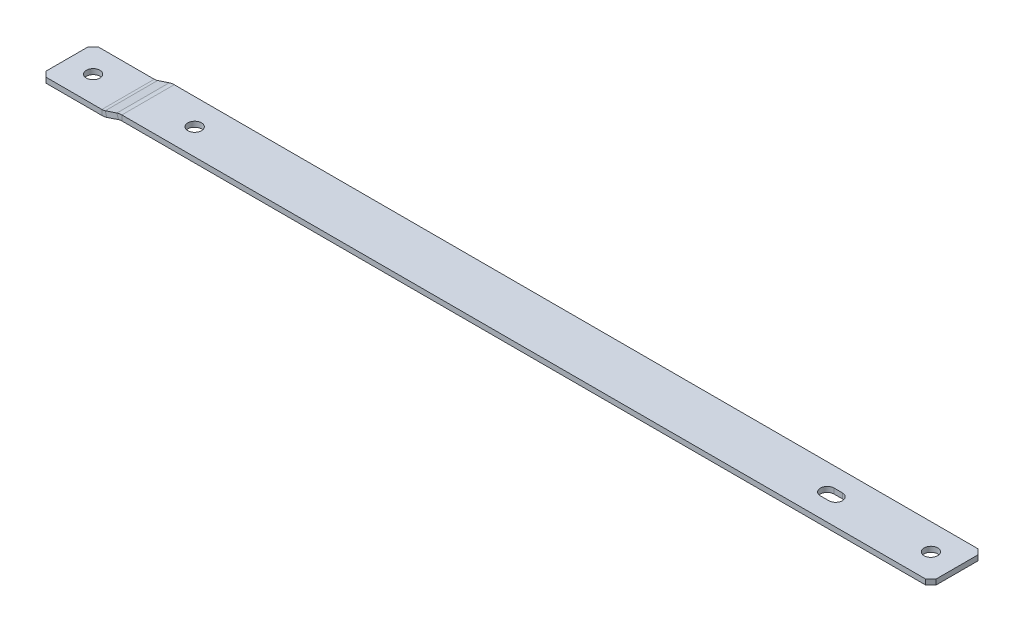
ISO-10303-21;
HEADER;
FILE_DESCRIPTION(('STEP AP214'),'2;1');
FILE_NAME('part.step','',(''),(''),'','','');
FILE_SCHEMA(('AUTOMOTIVE_DESIGN { 1 0 10303 214 1 1 1 1 }'));
ENDSEC;
DATA;
#1=APPLICATION_CONTEXT('core data for automotive mechanical design processes');
#2=APPLICATION_PROTOCOL_DEFINITION('international standard','automotive_design',2000,#1);
#3=PRODUCT_CONTEXT('',#1,'mechanical');
#4=PRODUCT('Part','Part','',(#3));
#5=PRODUCT_RELATED_PRODUCT_CATEGORY('part','',(#4));
#6=PRODUCT_DEFINITION_FORMATION('','',#4);
#7=PRODUCT_DEFINITION_CONTEXT('part definition',#1,'design');
#8=PRODUCT_DEFINITION('design','',#6,#7);
#9=PRODUCT_DEFINITION_SHAPE('','',#8);
#10=(LENGTH_UNIT() NAMED_UNIT(*) SI_UNIT(.MILLI.,.METRE.));
#11=(NAMED_UNIT(*) PLANE_ANGLE_UNIT() SI_UNIT($,.RADIAN.));
#12=(NAMED_UNIT(*) SI_UNIT($,.STERADIAN.) SOLID_ANGLE_UNIT());
#13=UNCERTAINTY_MEASURE_WITH_UNIT(LENGTH_MEASURE(1.E-05),#10,'distance_accuracy_value','');
#14=(GEOMETRIC_REPRESENTATION_CONTEXT(3) GLOBAL_UNCERTAINTY_ASSIGNED_CONTEXT((#13)) GLOBAL_UNIT_ASSIGNED_CONTEXT((#10,
#11,#12)) REPRESENTATION_CONTEXT('',''));
#15=CARTESIAN_POINT('',(0.,0.,0.));
#16=DIRECTION('',(0.,0.,1.));
#17=DIRECTION('',(1.,0.,0.));
#18=AXIS2_PLACEMENT_3D('',#15,#16,#17);
#19=CARTESIAN_POINT('',(-282.91568932488,0.,50.));
#20=DIRECTION('',(0.,0.,1.));
#21=DIRECTION('',(1.,0.,0.));
#22=AXIS2_PLACEMENT_3D('',#19,#20,#21);
#23=PLANE('',#22);
#24=DIRECTION('',(0.,-1.,0.));
#25=VECTOR('',#24,1.);
#26=CARTESIAN_POINT('',(-282.91568932488,0.,50.));
#27=LINE('',#26,#25);
#28=CARTESIAN_POINT('',(-282.91568932488,0.,50.));
#29=VERTEX_POINT('',#28);
#30=CARTESIAN_POINT('',(-282.91568932488,-5.,50.));
#31=VERTEX_POINT('',#30);
#32=EDGE_CURVE('E332',#29,#31,#27,.T.);
#33=ORIENTED_EDGE('',*,*,#32,.F.);
#34=CARTESIAN_POINT('',(-282.91568932488,-15.,50.));
#35=DIRECTION('',(0.,0.,-1.));
#36=DIRECTION('',(-1.,0.,0.));
#37=AXIS2_PLACEMENT_3D('',#34,#35,#36);
#38=CIRCLE('',#37,15.);
#39=CARTESIAN_POINT('',(-287.659105815132,-0.769750529242294,50.));
#40=VERTEX_POINT('',#39);
#41=EDGE_CURVE('E236',#40,#29,#38,.T.);
#42=ORIENTED_EDGE('',*,*,#41,.F.);
#43=DIRECTION('',(-0.316227766016841,0.948683298050513,0.));
#44=VECTOR('',#43,1.);
#45=CARTESIAN_POINT('',(-286.077966985048,-5.51316701949486,50.));
#46=LINE('',#45,#44);
#47=CARTESIAN_POINT('',(-286.077966985048,-5.51316701949486,50.));
#48=VERTEX_POINT('',#47);
#49=EDGE_CURVE('E330',#48,#40,#46,.T.);
#50=ORIENTED_EDGE('',*,*,#49,.F.);
#51=CARTESIAN_POINT('',(-282.91568932488,-15.,50.));
#52=DIRECTION('',(0.,0.,1.));
#53=DIRECTION('',(1.,0.,0.));
#54=AXIS2_PLACEMENT_3D('',#51,#52,#53);
#55=CIRCLE('',#54,10.);
#56=EDGE_CURVE('E255',#48,#31,#55,.F.);
#57=ORIENTED_EDGE('',*,*,#56,.T.);
#58=EDGE_LOOP('',(#33,#42,#50,#57));
#59=FACE_BOUND('',#58,.T.);
#60=ADVANCED_FACE('F43',(#59),#23,.T.);
#61=CARTESIAN_POINT('',(-286.077966985048,-5.51316701949486,50.));
#62=DIRECTION('',(0.,0.,1.));
#63=DIRECTION('',(1.,0.,0.));
#64=AXIS2_PLACEMENT_3D('',#61,#62,#63);
#65=PLANE('',#64);
#66=DIRECTION('',(1.,0.,0.));
#67=VECTOR('',#66,1.);
#68=CARTESIAN_POINT('',(-285.349854227405,-5.,50.));
#69=LINE('',#68,#67);
#70=CARTESIAN_POINT('',(484.650145772595,-5.,50.));
#71=VERTEX_POINT('',#70);
#72=EDGE_CURVE('E229',#31,#71,#69,.T.);
#73=ORIENTED_EDGE('',*,*,#72,.T.);
#74=DIRECTION('',(0.,1.,0.));
#75=VECTOR('',#74,1.);
#76=CARTESIAN_POINT('',(484.650145772594,-5.51316701950342,50.));
#77=LINE('',#76,#75);
#78=CARTESIAN_POINT('',(484.650145772595,0.,50.));
#79=VERTEX_POINT('',#78);
#80=EDGE_CURVE('E355',#71,#79,#77,.T.);
#81=ORIENTED_EDGE('',*,*,#80,.T.);
#82=DIRECTION('',(1.,0.,0.));
#83=VECTOR('',#82,1.);
#84=CARTESIAN_POINT('',(-285.349854227405,0.,50.));
#85=LINE('',#84,#83);
#86=EDGE_CURVE('E232',#29,#79,#85,.T.);
#87=ORIENTED_EDGE('',*,*,#86,.F.);
#88=ORIENTED_EDGE('',*,*,#32,.T.);
#89=EDGE_LOOP('',(#73,#81,#87,#88));
#90=FACE_BOUND('',#89,.T.);
#91=ADVANCED_FACE('F445',(#90),#65,.T.);
#92=CARTESIAN_POINT('',(-287.659105815132,-0.769750529242294,0.));
#93=DIRECTION('',(0.,0.,-1.));
#94=DIRECTION('',(-1.,0.,0.));
#95=AXIS2_PLACEMENT_3D('',#92,#93,#94);
#96=PLANE('',#95);
#97=DIRECTION('',(0.316227766016841,-0.948683298050513,0.));
#98=VECTOR('',#97,1.);
#99=CARTESIAN_POINT('',(-287.659105815132,-0.769750529242294,0.));
#100=LINE('',#99,#98);
#101=CARTESIAN_POINT('',(-287.659105815132,-0.769750529242294,0.));
#102=VERTEX_POINT('',#101);
#103=CARTESIAN_POINT('',(-286.077966985048,-5.51316701949486,0.));
#104=VERTEX_POINT('',#103);
#105=EDGE_CURVE('E328',#102,#104,#100,.T.);
#106=ORIENTED_EDGE('',*,*,#105,.F.);
#107=CARTESIAN_POINT('',(-282.91568932488,-15.,0.));
#108=DIRECTION('',(0.,0.,-1.));
#109=DIRECTION('',(-1.,0.,0.));
#110=AXIS2_PLACEMENT_3D('',#107,#108,#109);
#111=CIRCLE('',#110,15.);
#112=CARTESIAN_POINT('',(-282.91568932488,0.,0.));
#113=VERTEX_POINT('',#112);
#114=EDGE_CURVE('E264',#102,#113,#111,.T.);
#115=ORIENTED_EDGE('',*,*,#114,.T.);
#116=DIRECTION('',(0.,1.,0.));
#117=VECTOR('',#116,1.);
#118=CARTESIAN_POINT('',(-282.91568932488,-5.,0.));
#119=LINE('',#118,#117);
#120=CARTESIAN_POINT('',(-282.91568932488,-5.,0.));
#121=VERTEX_POINT('',#120);
#122=EDGE_CURVE('E326',#121,#113,#119,.T.);
#123=ORIENTED_EDGE('',*,*,#122,.F.);
#124=CARTESIAN_POINT('',(-282.91568932488,-15.,0.));
#125=DIRECTION('',(0.,0.,1.));
#126=DIRECTION('',(1.,0.,0.));
#127=AXIS2_PLACEMENT_3D('',#124,#125,#126);
#128=CIRCLE('',#127,10.);
#129=EDGE_CURVE('E233',#104,#121,#128,.F.);
#130=ORIENTED_EDGE('',*,*,#129,.F.);
#131=EDGE_LOOP('',(#106,#115,#123,#130));
#132=FACE_BOUND('',#131,.T.);
#133=ADVANCED_FACE('F421',(#132),#96,.T.);
#134=CARTESIAN_POINT('',(-282.91568932488,-5.,0.));
#135=DIRECTION('',(0.,0.,-1.));
#136=DIRECTION('',(-1.,0.,0.));
#137=AXIS2_PLACEMENT_3D('',#134,#135,#136);
#138=PLANE('',#137);
#139=DIRECTION('',(0.948683298050514,0.316227766016838,0.));
#140=VECTOR('',#139,1.);
#141=CARTESIAN_POINT('',(-285.349854227405,0.,0.));
#142=LINE('',#141,#140);
#143=CARTESIAN_POINT('',(-298.810353168921,-4.48683298050514,0.));
#144=VERTEX_POINT('',#143);
#145=EDGE_CURVE('E267',#144,#102,#142,.T.);
#146=ORIENTED_EDGE('',*,*,#145,.T.);
#147=ORIENTED_EDGE('',*,*,#105,.T.);
#148=DIRECTION('',(0.948683298050514,0.316227766016838,0.));
#149=VECTOR('',#148,1.);
#150=CARTESIAN_POINT('',(-283.768715397321,-4.74341649025257,0.));
#151=LINE('',#150,#149);
#152=CARTESIAN_POINT('',(-297.229214338836,-9.23024947075771,0.));
#153=VERTEX_POINT('',#152);
#154=EDGE_CURVE('E280',#153,#104,#151,.T.);
#155=ORIENTED_EDGE('',*,*,#154,.F.);
#156=DIRECTION('',(-0.316227766016841,0.948683298050513,0.));
#157=VECTOR('',#156,1.);
#158=CARTESIAN_POINT('',(-297.229214338836,-9.23024947075771,0.));
#159=LINE('',#158,#157);
#160=EDGE_CURVE('E316',#153,#144,#159,.T.);
#161=ORIENTED_EDGE('',*,*,#160,.T.);
#162=EDGE_LOOP('',(#146,#147,#155,#161));
#163=FACE_BOUND('',#162,.T.);
#164=ADVANCED_FACE('F403',(#163),#138,.T.);
#165=CARTESIAN_POINT('',(-298.810353168921,-4.48683298050514,50.));
#166=DIRECTION('',(0.,0.,1.));
#167=DIRECTION('',(1.,0.,0.));
#168=AXIS2_PLACEMENT_3D('',#165,#166,#167);
#169=PLANE('',#168);
#170=DIRECTION('',(0.316227766016841,-0.948683298050513,0.));
#171=VECTOR('',#170,1.);
#172=CARTESIAN_POINT('',(-298.810353168921,-4.48683298050514,50.));
#173=LINE('',#172,#171);
#174=CARTESIAN_POINT('',(-298.810353168921,-4.48683298050514,50.));
#175=VERTEX_POINT('',#174);
#176=CARTESIAN_POINT('',(-297.229214338836,-9.23024947075771,50.));
#177=VERTEX_POINT('',#176);
#178=EDGE_CURVE('E324',#175,#177,#173,.T.);
#179=ORIENTED_EDGE('',*,*,#178,.F.);
#180=CARTESIAN_POINT('',(-301.972630829089,5.,50.));
#181=DIRECTION('',(0.,0.,1.));
#182=DIRECTION('',(1.,0.,0.));
#183=AXIS2_PLACEMENT_3D('',#180,#181,#182);
#184=CIRCLE('',#183,10.);
#185=CARTESIAN_POINT('',(-301.972630829089,-5.00000000000001,50.));
#186=VERTEX_POINT('',#185);
#187=EDGE_CURVE('E242',#186,#175,#184,.T.);
#188=ORIENTED_EDGE('',*,*,#187,.F.);
#189=DIRECTION('',(0.,1.,0.));
#190=VECTOR('',#189,1.);
#191=CARTESIAN_POINT('',(-301.972630829089,-10.,50.));
#192=LINE('',#191,#190);
#193=CARTESIAN_POINT('',(-301.972630829089,-10.,50.));
#194=VERTEX_POINT('',#193);
#195=EDGE_CURVE('E321',#194,#186,#192,.T.);
#196=ORIENTED_EDGE('',*,*,#195,.F.);
#197=CARTESIAN_POINT('',(-301.972630829089,5.,50.));
#198=DIRECTION('',(0.,0.,1.));
#199=DIRECTION('',(1.,0.,0.));
#200=AXIS2_PLACEMENT_3D('',#197,#198,#199);
#201=CIRCLE('',#200,15.);
#202=EDGE_CURVE('E249',#194,#177,#201,.T.);
#203=ORIENTED_EDGE('',*,*,#202,.T.);
#204=EDGE_LOOP('',(#179,#188,#196,#203));
#205=FACE_BOUND('',#204,.T.);
#206=ADVANCED_FACE('F437',(#205),#169,.T.);
#207=CARTESIAN_POINT('',(-301.972630829089,-10.,50.));
#208=DIRECTION('',(0.,0.,1.));
#209=DIRECTION('',(1.,0.,0.));
#210=AXIS2_PLACEMENT_3D('',#207,#208,#209);
#211=PLANE('',#210);
#212=DIRECTION('',(0.948683298050514,0.316227766016838,0.));
#213=VECTOR('',#212,1.);
#214=CARTESIAN_POINT('',(-285.349854227405,0.,50.));
#215=LINE('',#214,#213);
#216=EDGE_CURVE('E239',#175,#40,#215,.T.);
#217=ORIENTED_EDGE('',*,*,#216,.F.);
#218=ORIENTED_EDGE('',*,*,#178,.T.);
#219=DIRECTION('',(0.948683298050514,0.316227766016838,0.));
#220=VECTOR('',#219,1.);
#221=CARTESIAN_POINT('',(-283.768715397321,-4.74341649025257,50.));
#222=LINE('',#221,#220);
#223=EDGE_CURVE('E252',#177,#48,#222,.T.);
#224=ORIENTED_EDGE('',*,*,#223,.T.);
#225=ORIENTED_EDGE('',*,*,#49,.T.);
#226=EDGE_LOOP('',(#217,#218,#224,#225));
#227=FACE_BOUND('',#226,.T.);
#228=ADVANCED_FACE('F434',(#227),#211,.T.);
#229=CARTESIAN_POINT('',(-301.972630829089,-5.00000000000001,0.));
#230=DIRECTION('',(0.,0.,-1.));
#231=DIRECTION('',(-1.,0.,0.));
#232=AXIS2_PLACEMENT_3D('',#229,#230,#231);
#233=PLANE('',#232);
#234=DIRECTION('',(0.,-1.,0.));
#235=VECTOR('',#234,1.);
#236=CARTESIAN_POINT('',(-301.972630829089,-5.00000000000001,0.));
#237=LINE('',#236,#235);
#238=CARTESIAN_POINT('',(-301.972630829089,-5.00000000000001,0.));
#239=VERTEX_POINT('',#238);
#240=CARTESIAN_POINT('',(-301.972630829089,-10.,0.));
#241=VERTEX_POINT('',#240);
#242=EDGE_CURVE('E318',#239,#241,#237,.T.);
#243=ORIENTED_EDGE('',*,*,#242,.F.);
#244=CARTESIAN_POINT('',(-301.972630829089,5.,0.));
#245=DIRECTION('',(0.,0.,1.));
#246=DIRECTION('',(1.,0.,0.));
#247=AXIS2_PLACEMENT_3D('',#244,#245,#246);
#248=CIRCLE('',#247,10.);
#249=EDGE_CURVE('E270',#239,#144,#248,.T.);
#250=ORIENTED_EDGE('',*,*,#249,.T.);
#251=ORIENTED_EDGE('',*,*,#160,.F.);
#252=CARTESIAN_POINT('',(-301.972630829089,5.,0.));
#253=DIRECTION('',(0.,0.,1.));
#254=DIRECTION('',(1.,0.,0.));
#255=AXIS2_PLACEMENT_3D('',#252,#253,#254);
#256=CIRCLE('',#255,15.);
#257=EDGE_CURVE('E277',#241,#153,#256,.T.);
#258=ORIENTED_EDGE('',*,*,#257,.F.);
#259=EDGE_LOOP('',(#243,#250,#251,#258));
#260=FACE_BOUND('',#259,.T.);
#261=ADVANCED_FACE('F399',(#260),#233,.T.);
#262=CARTESIAN_POINT('',(-297.229214338836,-9.23024947075771,0.));
#263=DIRECTION('',(0.,0.,-1.));
#264=DIRECTION('',(-1.,0.,0.));
#265=AXIS2_PLACEMENT_3D('',#262,#263,#264);
#266=PLANE('',#265);
#267=DIRECTION('',(1.,0.,0.));
#268=VECTOR('',#267,1.);
#269=CARTESIAN_POINT('',(-300.349854227405,-10.,0.));
#270=LINE('',#269,#268);
#271=CARTESIAN_POINT('',(-355.349854227405,-10.,0.));
#272=VERTEX_POINT('',#271);
#273=EDGE_CURVE('E275',#272,#241,#270,.T.);
#274=ORIENTED_EDGE('',*,*,#273,.F.);
#275=DIRECTION('',(0.,1.,0.));
#276=VECTOR('',#275,1.);
#277=CARTESIAN_POINT('',(-355.349854227405,-9.23024947075771,0.));
#278=LINE('',#277,#276);
#279=CARTESIAN_POINT('',(-355.349854227405,-5.00000000000001,0.));
#280=VERTEX_POINT('',#279);
#281=EDGE_CURVE('E359',#272,#280,#278,.T.);
#282=ORIENTED_EDGE('',*,*,#281,.T.);
#283=DIRECTION('',(1.,0.,0.));
#284=VECTOR('',#283,1.);
#285=CARTESIAN_POINT('',(-300.349854227405,-5.00000000000001,0.));
#286=LINE('',#285,#284);
#287=EDGE_CURVE('E273',#280,#239,#286,.T.);
#288=ORIENTED_EDGE('',*,*,#287,.T.);
#289=ORIENTED_EDGE('',*,*,#242,.T.);
#290=EDGE_LOOP('',(#274,#282,#288,#289));
#291=FACE_BOUND('',#290,.T.);
#292=ADVANCED_FACE('F391',(#291),#266,.T.);
#293=CARTESIAN_POINT('',(-285.349854227405,-5.,50.));
#294=DIRECTION('',(0.,1.,0.));
#295=DIRECTION('',(0.,0.,1.));
#296=AXIS2_PLACEMENT_3D('',#293,#294,#295);
#297=PLANE('',#296);
#298=CARTESIAN_POINT('',(-238.349854227405,-5.,25.));
#299=DIRECTION('',(0.,1.,0.));
#300=DIRECTION('',(0.,0.,1.));
#301=AXIS2_PLACEMENT_3D('',#298,#299,#300);
#302=CIRCLE('',#301,6.50000000000002);
#303=CARTESIAN_POINT('',(-238.349854227405,-5.,31.5));
#304=VERTEX_POINT('',#303);
#305=EDGE_CURVE('E814',#304,#304,#302,.T.);
#306=ORIENTED_EDGE('',*,*,#305,.T.);
#307=EDGE_LOOP('',(#306));
#308=FACE_BOUND('',#307,.T.);
#309=DIRECTION('',(-1.,0.,0.));
#310=VECTOR('',#309,1.);
#311=CARTESIAN_POINT('',(-285.349854227405,-5.,18.5000000000003));
#312=LINE('',#311,#310);
#313=CARTESIAN_POINT('',(373.650145772595,-5.,18.5));
#314=VERTEX_POINT('',#313);
#315=CARTESIAN_POINT('',(365.650145772595,-5.,18.5));
#316=VERTEX_POINT('',#315);
#317=EDGE_CURVE('E216',#314,#316,#312,.T.);
#318=ORIENTED_EDGE('',*,*,#317,.T.);
#319=CARTESIAN_POINT('',(365.650145772595,-5.,25.));
#320=DIRECTION('',(0.,1.,0.));
#321=DIRECTION('',(0.,0.,1.));
#322=AXIS2_PLACEMENT_3D('',#319,#320,#321);
#323=CIRCLE('',#322,6.5);
#324=CARTESIAN_POINT('',(365.650145772595,-5.,31.5));
#325=VERTEX_POINT('',#324);
#326=EDGE_CURVE('E219',#316,#325,#323,.T.);
#327=ORIENTED_EDGE('',*,*,#326,.T.);
#328=DIRECTION('',(1.,0.,0.));
#329=VECTOR('',#328,1.);
#330=CARTESIAN_POINT('',(-285.349854227405,-5.,31.5));
#331=LINE('',#330,#329);
#332=CARTESIAN_POINT('',(373.650145772595,-5.,31.5));
#333=VERTEX_POINT('',#332);
#334=EDGE_CURVE('E211',#325,#333,#331,.T.);
#335=ORIENTED_EDGE('',*,*,#334,.T.);
#336=CARTESIAN_POINT('',(373.650145772595,-5.,25.));
#337=DIRECTION('',(0.,1.,0.));
#338=DIRECTION('',(0.,0.,1.));
#339=AXIS2_PLACEMENT_3D('',#336,#337,#338);
#340=CIRCLE('',#339,6.5);
#341=EDGE_CURVE('E186',#333,#314,#340,.T.);
#342=ORIENTED_EDGE('',*,*,#341,.T.);
#343=EDGE_LOOP('',(#318,#327,#335,#342));
#344=FACE_BOUND('',#343,.T.);
#345=CARTESIAN_POINT('',(464.650145772595,-5.,25.));
#346=DIRECTION('',(0.,1.,0.));
#347=DIRECTION('',(0.,0.,1.));
#348=AXIS2_PLACEMENT_3D('',#345,#346,#347);
#349=CIRCLE('',#348,6.50000000000002);
#350=CARTESIAN_POINT('',(464.650145772595,-5.,31.5));
#351=VERTEX_POINT('',#350);
#352=EDGE_CURVE('E225',#351,#351,#349,.T.);
#353=ORIENTED_EDGE('',*,*,#352,.T.);
#354=EDGE_LOOP('',(#353));
#355=FACE_BOUND('',#354,.T.);
#356=DIRECTION('',(0.,0.,-1.));
#357=VECTOR('',#356,1.);
#358=CARTESIAN_POINT('',(489.650145772595,-5.,50.));
#359=LINE('',#358,#357);
#360=CARTESIAN_POINT('',(489.650145772595,-5.,45.));
#361=VERTEX_POINT('',#360);
#362=CARTESIAN_POINT('',(489.650145772595,-5.,5.00000000000003));
#363=VERTEX_POINT('',#362);
#364=EDGE_CURVE('E314',#361,#363,#359,.T.);
#365=ORIENTED_EDGE('',*,*,#364,.F.);
#366=DIRECTION('',(0.707106781186557,0.,-0.707106781186538));
#367=VECTOR('',#366,1.);
#368=CARTESIAN_POINT('',(489.650145772595,-5.,44.9999999999999));
#369=LINE('',#368,#367);
#370=EDGE_CURVE('E353',#361,#71,#369,.F.);
#371=ORIENTED_EDGE('',*,*,#370,.T.);
#372=ORIENTED_EDGE('',*,*,#72,.F.);
#373=DIRECTION('',(0.,0.,-1.));
#374=VECTOR('',#373,1.);
#375=CARTESIAN_POINT('',(-282.91568932488,-5.,50.));
#376=LINE('',#375,#374);
#377=EDGE_CURVE('E258',#31,#121,#376,.T.);
#378=ORIENTED_EDGE('',*,*,#377,.T.);
#379=DIRECTION('',(1.,0.,0.));
#380=VECTOR('',#379,1.);
#381=CARTESIAN_POINT('',(-285.349854227405,-5.,0.));
#382=LINE('',#381,#380);
#383=CARTESIAN_POINT('',(484.650145772594,-5.,0.));
#384=VERTEX_POINT('',#383);
#385=EDGE_CURVE('E228',#121,#384,#382,.T.);
#386=ORIENTED_EDGE('',*,*,#385,.T.);
#387=DIRECTION('',(-0.707106781186561,0.,-0.707106781186534));
#388=VECTOR('',#387,1.);
#389=CARTESIAN_POINT('',(484.650145772594,-5.,0.));
#390=LINE('',#389,#388);
#391=EDGE_CURVE('E342',#384,#363,#390,.F.);
#392=ORIENTED_EDGE('',*,*,#391,.T.);
#393=EDGE_LOOP('',(#365,#371,#372,#378,#386,#392));
#394=FACE_BOUND('',#393,.T.);
#395=ADVANCED_FACE('F480',(#308,#344,#355,#394),#297,.F.);
#396=CARTESIAN_POINT('',(489.650145772595,0.,50.));
#397=DIRECTION('',(1.,0.,0.));
#398=DIRECTION('',(0.,1.,0.));
#399=AXIS2_PLACEMENT_3D('',#396,#397,#398);
#400=PLANE('',#399);
#401=DIRECTION('',(0.,0.,-1.));
#402=VECTOR('',#401,1.);
#403=CARTESIAN_POINT('',(489.650145772595,0.,50.));
#404=LINE('',#403,#402);
#405=CARTESIAN_POINT('',(489.650145772595,0.,45.));
#406=VERTEX_POINT('',#405);
#407=CARTESIAN_POINT('',(489.650145772595,0.,5.00000000000003));
#408=VERTEX_POINT('',#407);
#409=EDGE_CURVE('E312',#406,#408,#404,.T.);
#410=ORIENTED_EDGE('',*,*,#409,.F.);
#411=DIRECTION('',(0.,-1.,0.));
#412=VECTOR('',#411,1.);
#413=CARTESIAN_POINT('',(489.650145772595,0.,45.));
#414=LINE('',#413,#412);
#415=EDGE_CURVE('E350',#406,#361,#414,.T.);
#416=ORIENTED_EDGE('',*,*,#415,.T.);
#417=ORIENTED_EDGE('',*,*,#364,.T.);
#418=DIRECTION('',(0.,1.,0.));
#419=VECTOR('',#418,1.);
#420=CARTESIAN_POINT('',(489.650145772595,0.,5.00000000000003));
#421=LINE('',#420,#419);
#422=EDGE_CURVE('E345',#363,#408,#421,.T.);
#423=ORIENTED_EDGE('',*,*,#422,.T.);
#424=EDGE_LOOP('',(#410,#416,#417,#423));
#425=FACE_BOUND('',#424,.T.);
#426=ADVANCED_FACE('F471',(#425),#400,.T.);
#427=CARTESIAN_POINT('',(-285.349854227405,0.,50.));
#428=DIRECTION('',(0.,1.,0.));
#429=DIRECTION('',(0.,0.,1.));
#430=AXIS2_PLACEMENT_3D('',#427,#428,#429);
#431=PLANE('',#430);
#432=CARTESIAN_POINT('',(-238.349854227405,0.,25.));
#433=DIRECTION('',(0.,1.,0.));
#434=DIRECTION('',(0.,0.,1.));
#435=AXIS2_PLACEMENT_3D('',#432,#433,#434);
#436=CIRCLE('',#435,6.50000000000002);
#437=CARTESIAN_POINT('',(-238.349854227405,0.,31.5));
#438=VERTEX_POINT('',#437);
#439=EDGE_CURVE('E338',#438,#438,#436,.T.);
#440=ORIENTED_EDGE('',*,*,#439,.F.);
#441=EDGE_LOOP('',(#440));
#442=FACE_BOUND('',#441,.T.);
#443=CARTESIAN_POINT('',(365.650145772595,0.,25.));
#444=DIRECTION('',(0.,1.,0.));
#445=DIRECTION('',(0.,0.,1.));
#446=AXIS2_PLACEMENT_3D('',#443,#444,#445);
#447=CIRCLE('',#446,6.5);
#448=CARTESIAN_POINT('',(365.650145772595,0.,18.5));
#449=VERTEX_POINT('',#448);
#450=CARTESIAN_POINT('',(365.650145772595,0.,31.5));
#451=VERTEX_POINT('',#450);
#452=EDGE_CURVE('E199',#449,#451,#447,.T.);
#453=ORIENTED_EDGE('',*,*,#452,.F.);
#454=DIRECTION('',(-1.,0.,0.));
#455=VECTOR('',#454,1.);
#456=CARTESIAN_POINT('',(365.650145772595,0.,18.5));
#457=LINE('',#456,#455);
#458=CARTESIAN_POINT('',(373.650145772595,0.,18.5));
#459=VERTEX_POINT('',#458);
#460=EDGE_CURVE('E204',#459,#449,#457,.T.);
#461=ORIENTED_EDGE('',*,*,#460,.F.);
#462=CARTESIAN_POINT('',(373.650145772595,0.,25.));
#463=DIRECTION('',(0.,1.,0.));
#464=DIRECTION('',(0.,0.,1.));
#465=AXIS2_PLACEMENT_3D('',#462,#463,#464);
#466=CIRCLE('',#465,6.5);
#467=CARTESIAN_POINT('',(373.650145772595,0.,31.5));
#468=VERTEX_POINT('',#467);
#469=EDGE_CURVE('E183',#468,#459,#466,.T.);
#470=ORIENTED_EDGE('',*,*,#469,.F.);
#471=DIRECTION('',(1.,0.,0.));
#472=VECTOR('',#471,1.);
#473=CARTESIAN_POINT('',(365.650145772595,0.,31.5));
#474=LINE('',#473,#472);
#475=EDGE_CURVE('E194',#451,#468,#474,.T.);
#476=ORIENTED_EDGE('',*,*,#475,.F.);
#477=EDGE_LOOP('',(#453,#461,#470,#476));
#478=FACE_BOUND('',#477,.T.);
#479=CARTESIAN_POINT('',(464.650145772595,0.,25.));
#480=DIRECTION('',(0.,1.,0.));
#481=DIRECTION('',(0.,0.,1.));
#482=AXIS2_PLACEMENT_3D('',#479,#480,#481);
#483=CIRCLE('',#482,6.50000000000002);
#484=CARTESIAN_POINT('',(464.650145772595,0.,31.5));
#485=VERTEX_POINT('',#484);
#486=EDGE_CURVE('E222',#485,#485,#483,.T.);
#487=ORIENTED_EDGE('',*,*,#486,.F.);
#488=EDGE_LOOP('',(#487));
#489=FACE_BOUND('',#488,.T.);
#490=ORIENTED_EDGE('',*,*,#86,.T.);
#491=DIRECTION('',(-0.707106781186557,0.,0.707106781186538));
#492=VECTOR('',#491,1.);
#493=CARTESIAN_POINT('',(99.6501457725846,0.,435.));
#494=LINE('',#493,#492);
#495=EDGE_CURVE('E357',#79,#406,#494,.F.);
#496=ORIENTED_EDGE('',*,*,#495,.T.);
#497=ORIENTED_EDGE('',*,*,#409,.T.);
#498=DIRECTION('',(0.707106781186561,0.,0.707106781186534));
#499=VECTOR('',#498,1.);
#500=CARTESIAN_POINT('',(124.65014577258,0.,-360.000000000001));
#501=LINE('',#500,#499);
#502=CARTESIAN_POINT('',(484.650145772595,0.,0.));
#503=VERTEX_POINT('',#502);
#504=EDGE_CURVE('E348',#408,#503,#501,.F.);
#505=ORIENTED_EDGE('',*,*,#504,.T.);
#506=DIRECTION('',(1.,0.,0.));
#507=VECTOR('',#506,1.);
#508=CARTESIAN_POINT('',(-285.349854227405,0.,0.));
#509=LINE('',#508,#507);
#510=EDGE_CURVE('E261',#113,#503,#509,.T.);
#511=ORIENTED_EDGE('',*,*,#510,.F.);
#512=DIRECTION('',(0.,0.,-1.));
#513=VECTOR('',#512,1.);
#514=CARTESIAN_POINT('',(-282.91568932488,0.,50.));
#515=LINE('',#514,#513);
#516=EDGE_CURVE('E309',#29,#113,#515,.T.);
#517=ORIENTED_EDGE('',*,*,#516,.F.);
#518=EDGE_LOOP('',(#490,#496,#497,#505,#511,#517));
#519=FACE_BOUND('',#518,.T.);
#520=ADVANCED_FACE('F201',(#442,#478,#489,#519),#431,.T.);
#521=CARTESIAN_POINT('',(-282.91568932488,-15.,50.));
#522=DIRECTION('',(0.,0.,-1.));
#523=DIRECTION('',(-1.,0.,0.));
#524=AXIS2_PLACEMENT_3D('',#521,#522,#523);
#525=CYLINDRICAL_SURFACE('',#524,15.);
#526=ORIENTED_EDGE('',*,*,#114,.F.);
#527=DIRECTION('',(0.,0.,-1.));
#528=VECTOR('',#527,1.);
#529=CARTESIAN_POINT('',(-287.659105815132,-0.769750529242294,50.));
#530=LINE('',#529,#528);
#531=EDGE_CURVE('E306',#40,#102,#530,.T.);
#532=ORIENTED_EDGE('',*,*,#531,.F.);
#533=ORIENTED_EDGE('',*,*,#41,.T.);
#534=ORIENTED_EDGE('',*,*,#516,.T.);
#535=EDGE_LOOP('',(#526,#532,#533,#534));
#536=FACE_BOUND('',#535,.T.);
#537=ADVANCED_FACE('F417',(#536),#525,.T.);
#538=CARTESIAN_POINT('',(-285.349854227405,0.,50.));
#539=DIRECTION('',(-0.316227766016838,0.948683298050514,0.));
#540=DIRECTION('',(-0.948683298050514,-0.316227766016838,0.));
#541=AXIS2_PLACEMENT_3D('',#538,#539,#540);
#542=PLANE('',#541);
#543=ORIENTED_EDGE('',*,*,#145,.F.);
#544=DIRECTION('',(0.,0.,-1.));
#545=VECTOR('',#544,1.);
#546=CARTESIAN_POINT('',(-298.810353168921,-4.48683298050514,50.));
#547=LINE('',#546,#545);
#548=EDGE_CURVE('E303',#175,#144,#547,.T.);
#549=ORIENTED_EDGE('',*,*,#548,.F.);
#550=ORIENTED_EDGE('',*,*,#216,.T.);
#551=ORIENTED_EDGE('',*,*,#531,.T.);
#552=EDGE_LOOP('',(#543,#549,#550,#551));
#553=FACE_BOUND('',#552,.T.);
#554=ADVANCED_FACE('F412',(#553),#542,.T.);
#555=CARTESIAN_POINT('',(-301.972630829089,5.,50.));
#556=DIRECTION('',(0.,0.,-1.));
#557=DIRECTION('',(-1.,0.,0.));
#558=AXIS2_PLACEMENT_3D('',#555,#556,#557);
#559=CYLINDRICAL_SURFACE('',#558,10.);
#560=ORIENTED_EDGE('',*,*,#249,.F.);
#561=DIRECTION('',(0.,0.,-1.));
#562=VECTOR('',#561,1.);
#563=CARTESIAN_POINT('',(-301.972630829089,-5.00000000000001,50.));
#564=LINE('',#563,#562);
#565=EDGE_CURVE('E300',#186,#239,#564,.T.);
#566=ORIENTED_EDGE('',*,*,#565,.F.);
#567=ORIENTED_EDGE('',*,*,#187,.T.);
#568=ORIENTED_EDGE('',*,*,#548,.T.);
#569=EDGE_LOOP('',(#560,#566,#567,#568));
#570=FACE_BOUND('',#569,.T.);
#571=ADVANCED_FACE('F407',(#570),#559,.F.);
#572=CARTESIAN_POINT('',(-300.349854227405,-5.00000000000001,50.));
#573=DIRECTION('',(0.,1.,0.));
#574=DIRECTION('',(-1.,0.,0.));
#575=AXIS2_PLACEMENT_3D('',#572,#573,#574);
#576=PLANE('',#575);
#577=CARTESIAN_POINT('',(-335.349854227405,-5.00000000000001,25.));
#578=DIRECTION('',(0.,1.,0.));
#579=DIRECTION('',(-1.,0.,0.));
#580=AXIS2_PLACEMENT_3D('',#577,#578,#579);
#581=CIRCLE('',#580,6.50000000000002);
#582=CARTESIAN_POINT('',(-341.849854227405,-5.00000000000001,25.));
#583=VERTEX_POINT('',#582);
#584=EDGE_CURVE('E339',#583,#583,#581,.T.);
#585=ORIENTED_EDGE('',*,*,#584,.F.);
#586=EDGE_LOOP('',(#585));
#587=FACE_BOUND('',#586,.T.);
#588=DIRECTION('',(0.,0.,-1.));
#589=VECTOR('',#588,1.);
#590=CARTESIAN_POINT('',(-360.349854227405,-5.00000000000002,50.));
#591=LINE('',#590,#589);
#592=CARTESIAN_POINT('',(-360.349854227405,-5.00000000000002,45.));
#593=VERTEX_POINT('',#592);
#594=CARTESIAN_POINT('',(-360.349854227405,-5.00000000000002,5.00000000000003));
#595=VERTEX_POINT('',#594);
#596=EDGE_CURVE('E298',#593,#595,#591,.T.);
#597=ORIENTED_EDGE('',*,*,#596,.F.);
#598=DIRECTION('',(0.707106781186549,0.,0.707106781186546));
#599=VECTOR('',#598,1.);
#600=CARTESIAN_POINT('',(-327.849854227405,-5.00000000000001,77.5));
#601=LINE('',#600,#599);
#602=CARTESIAN_POINT('',(-355.349854227405,-5.00000000000001,50.));
#603=VERTEX_POINT('',#602);
#604=EDGE_CURVE('E65',#593,#603,#601,.T.);
#605=ORIENTED_EDGE('',*,*,#604,.T.);
#606=DIRECTION('',(1.,0.,0.));
#607=VECTOR('',#606,1.);
#608=CARTESIAN_POINT('',(-300.349854227405,-5.00000000000001,50.));
#609=LINE('',#608,#607);
#610=EDGE_CURVE('E245',#603,#186,#609,.T.);
#611=ORIENTED_EDGE('',*,*,#610,.T.);
#612=ORIENTED_EDGE('',*,*,#565,.T.);
#613=ORIENTED_EDGE('',*,*,#287,.F.);
#614=DIRECTION('',(0.707106781186549,0.,-0.707106781186546));
#615=VECTOR('',#614,1.);
#616=CARTESIAN_POINT('',(-352.849854227405,-5.00000000000001,-2.5000000000001));
#617=LINE('',#616,#615);
#618=EDGE_CURVE('E362',#280,#595,#617,.F.);
#619=ORIENTED_EDGE('',*,*,#618,.T.);
#620=EDGE_LOOP('',(#597,#605,#611,#612,#613,#619));
#621=FACE_BOUND('',#620,.T.);
#622=ADVANCED_FACE('F379',(#587,#621),#576,.T.);
#623=CARTESIAN_POINT('',(-360.349854227405,-10.,50.));
#624=DIRECTION('',(-1.,0.,0.));
#625=DIRECTION('',(0.,0.,1.));
#626=AXIS2_PLACEMENT_3D('',#623,#624,#625);
#627=PLANE('',#626);
#628=DIRECTION('',(0.,0.,-1.));
#629=VECTOR('',#628,1.);
#630=CARTESIAN_POINT('',(-360.349854227405,-10.,50.));
#631=LINE('',#630,#629);
#632=CARTESIAN_POINT('',(-360.349854227405,-10.,45.));
#633=VERTEX_POINT('',#632);
#634=CARTESIAN_POINT('',(-360.349854227405,-10.,5.00000000000003));
#635=VERTEX_POINT('',#634);
#636=EDGE_CURVE('E296',#633,#635,#631,.T.);
#637=ORIENTED_EDGE('',*,*,#636,.F.);
#638=DIRECTION('',(0.,1.,0.));
#639=VECTOR('',#638,1.);
#640=CARTESIAN_POINT('',(-360.349854227405,-5.00000000000002,45.));
#641=LINE('',#640,#639);
#642=EDGE_CURVE('E370',#633,#593,#641,.T.);
#643=ORIENTED_EDGE('',*,*,#642,.T.);
#644=ORIENTED_EDGE('',*,*,#596,.T.);
#645=DIRECTION('',(0.,-1.,0.));
#646=VECTOR('',#645,1.);
#647=CARTESIAN_POINT('',(-360.349854227405,-10.,5.00000000000003));
#648=LINE('',#647,#646);
#649=EDGE_CURVE('E365',#595,#635,#648,.T.);
#650=ORIENTED_EDGE('',*,*,#649,.T.);
#651=EDGE_LOOP('',(#637,#643,#644,#650));
#652=FACE_BOUND('',#651,.T.);
#653=ADVANCED_FACE('F376',(#652),#627,.T.);
#654=CARTESIAN_POINT('',(-300.349854227405,-10.,50.));
#655=DIRECTION('',(0.,1.,0.));
#656=DIRECTION('',(-1.,0.,0.));
#657=AXIS2_PLACEMENT_3D('',#654,#655,#656);
#658=PLANE('',#657);
#659=CARTESIAN_POINT('',(-335.349854227405,-10.,25.));
#660=DIRECTION('',(0.,1.,0.));
#661=DIRECTION('',(-1.,0.,0.));
#662=AXIS2_PLACEMENT_3D('',#659,#660,#661);
#663=CIRCLE('',#662,6.50000000000002);
#664=CARTESIAN_POINT('',(-341.849854227405,-10.,25.));
#665=VERTEX_POINT('',#664);
#666=EDGE_CURVE('E335',#665,#665,#663,.T.);
#667=ORIENTED_EDGE('',*,*,#666,.T.);
#668=EDGE_LOOP('',(#667));
#669=FACE_BOUND('',#668,.T.);
#670=DIRECTION('',(1.,0.,0.));
#671=VECTOR('',#670,1.);
#672=CARTESIAN_POINT('',(-300.349854227405,-10.,50.));
#673=LINE('',#672,#671);
#674=CARTESIAN_POINT('',(-355.349854227405,-10.,50.));
#675=VERTEX_POINT('',#674);
#676=EDGE_CURVE('E247',#675,#194,#673,.T.);
#677=ORIENTED_EDGE('',*,*,#676,.F.);
#678=DIRECTION('',(-0.707106781186549,0.,-0.707106781186546));
#679=VECTOR('',#678,1.);
#680=CARTESIAN_POINT('',(-360.349854227405,-10.,45.));
#681=LINE('',#680,#679);
#682=EDGE_CURVE('E11',#675,#633,#681,.T.);
#683=ORIENTED_EDGE('',*,*,#682,.T.);
#684=ORIENTED_EDGE('',*,*,#636,.T.);
#685=DIRECTION('',(-0.707106781186549,0.,0.707106781186546));
#686=VECTOR('',#685,1.);
#687=CARTESIAN_POINT('',(-355.349854227405,-10.,0.));
#688=LINE('',#687,#686);
#689=EDGE_CURVE('E368',#635,#272,#688,.F.);
#690=ORIENTED_EDGE('',*,*,#689,.T.);
#691=ORIENTED_EDGE('',*,*,#273,.T.);
#692=DIRECTION('',(0.,0.,-1.));
#693=VECTOR('',#692,1.);
#694=CARTESIAN_POINT('',(-301.972630829089,-10.,50.));
#695=LINE('',#694,#693);
#696=EDGE_CURVE('E293',#194,#241,#695,.T.);
#697=ORIENTED_EDGE('',*,*,#696,.F.);
#698=EDGE_LOOP('',(#677,#683,#684,#690,#691,#697));
#699=FACE_BOUND('',#698,.T.);
#700=ADVANCED_FACE('F388',(#669,#699),#658,.F.);
#701=CARTESIAN_POINT('',(-301.972630829089,5.,50.));
#702=DIRECTION('',(0.,0.,-1.));
#703=DIRECTION('',(-1.,0.,0.));
#704=AXIS2_PLACEMENT_3D('',#701,#702,#703);
#705=CYLINDRICAL_SURFACE('',#704,15.);
#706=ORIENTED_EDGE('',*,*,#257,.T.);
#707=DIRECTION('',(0.,0.,-1.));
#708=VECTOR('',#707,1.);
#709=CARTESIAN_POINT('',(-297.229214338836,-9.23024947075771,50.));
#710=LINE('',#709,#708);
#711=EDGE_CURVE('E290',#177,#153,#710,.T.);
#712=ORIENTED_EDGE('',*,*,#711,.F.);
#713=ORIENTED_EDGE('',*,*,#202,.F.);
#714=ORIENTED_EDGE('',*,*,#696,.T.);
#715=EDGE_LOOP('',(#706,#712,#713,#714));
#716=FACE_BOUND('',#715,.T.);
#717=ADVANCED_FACE('F397',(#716),#705,.T.);
#718=CARTESIAN_POINT('',(-283.768715397321,-4.74341649025257,50.));
#719=DIRECTION('',(-0.316227766016838,0.948683298050514,0.));
#720=DIRECTION('',(-0.948683298050514,-0.316227766016838,0.));
#721=AXIS2_PLACEMENT_3D('',#718,#719,#720);
#722=PLANE('',#721);
#723=ORIENTED_EDGE('',*,*,#154,.T.);
#724=DIRECTION('',(0.,0.,-1.));
#725=VECTOR('',#724,1.);
#726=CARTESIAN_POINT('',(-286.077966985048,-5.51316701949486,50.));
#727=LINE('',#726,#725);
#728=EDGE_CURVE('E287',#48,#104,#727,.T.);
#729=ORIENTED_EDGE('',*,*,#728,.F.);
#730=ORIENTED_EDGE('',*,*,#223,.F.);
#731=ORIENTED_EDGE('',*,*,#711,.T.);
#732=EDGE_LOOP('',(#723,#729,#730,#731));
#733=FACE_BOUND('',#732,.T.);
#734=ADVANCED_FACE('F425',(#733),#722,.F.);
#735=CARTESIAN_POINT('',(-282.91568932488,-15.,50.));
#736=DIRECTION('',(0.,0.,-1.));
#737=DIRECTION('',(-1.,0.,0.));
#738=AXIS2_PLACEMENT_3D('',#735,#736,#737);
#739=CYLINDRICAL_SURFACE('',#738,10.);
#740=ORIENTED_EDGE('',*,*,#129,.T.);
#741=ORIENTED_EDGE('',*,*,#377,.F.);
#742=ORIENTED_EDGE('',*,*,#56,.F.);
#743=ORIENTED_EDGE('',*,*,#728,.T.);
#744=EDGE_LOOP('',(#740,#741,#742,#743));
#745=FACE_BOUND('',#744,.T.);
#746=ADVANCED_FACE('F429',(#745),#739,.F.);
#747=CARTESIAN_POINT('',(-282.91568932488,-15.,50.));
#748=DIRECTION('',(0.,0.,-1.));
#749=DIRECTION('',(-1.,0.,0.));
#750=AXIS2_PLACEMENT_3D('',#747,#748,#749);
#751=PLANE('',#750);
#752=ORIENTED_EDGE('',*,*,#610,.F.);
#753=DIRECTION('',(0.,-1.,0.));
#754=VECTOR('',#753,1.);
#755=CARTESIAN_POINT('',(-355.349854227405,-10.,50.));
#756=LINE('',#755,#754);
#757=EDGE_CURVE('E51',#603,#675,#756,.T.);
#758=ORIENTED_EDGE('',*,*,#757,.T.);
#759=ORIENTED_EDGE('',*,*,#676,.T.);
#760=ORIENTED_EDGE('',*,*,#195,.T.);
#761=EDGE_LOOP('',(#752,#758,#759,#760));
#762=FACE_BOUND('',#761,.T.);
#763=ADVANCED_FACE('F438',(#762),#751,.F.);
#764=CARTESIAN_POINT('',(-282.91568932488,-15.,0.));
#765=DIRECTION('',(0.,0.,-1.));
#766=DIRECTION('',(-1.,0.,0.));
#767=AXIS2_PLACEMENT_3D('',#764,#765,#766);
#768=PLANE('',#767);
#769=ORIENTED_EDGE('',*,*,#510,.T.);
#770=DIRECTION('',(0.,-1.,0.));
#771=VECTOR('',#770,1.);
#772=CARTESIAN_POINT('',(484.650145772594,-15.0000000000085,0.));
#773=LINE('',#772,#771);
#774=EDGE_CURVE('E334',#503,#384,#773,.T.);
#775=ORIENTED_EDGE('',*,*,#774,.T.);
#776=ORIENTED_EDGE('',*,*,#385,.F.);
#777=ORIENTED_EDGE('',*,*,#122,.T.);
#778=EDGE_LOOP('',(#769,#775,#776,#777));
#779=FACE_BOUND('',#778,.T.);
#780=ADVANCED_FACE('F477',(#779),#768,.T.);
#781=CARTESIAN_POINT('',(464.650145772595,-10.,25.));
#782=DIRECTION('',(0.,1.,0.));
#783=DIRECTION('',(0.,0.,1.));
#784=AXIS2_PLACEMENT_3D('',#781,#782,#783);
#785=CYLINDRICAL_SURFACE('',#784,6.50000000000002);
#786=ORIENTED_EDGE('',*,*,#486,.T.);
#787=EDGE_LOOP('',(#786));
#788=FACE_BOUND('',#787,.T.);
#789=ORIENTED_EDGE('',*,*,#352,.F.);
#790=EDGE_LOOP('',(#789));
#791=FACE_BOUND('',#790,.T.);
#792=ADVANCED_FACE('F575',(#788,#791),#785,.F.);
#793=CARTESIAN_POINT('',(365.650145772595,-10.,25.));
#794=DIRECTION('',(0.,1.,0.));
#795=DIRECTION('',(0.,0.,1.));
#796=AXIS2_PLACEMENT_3D('',#793,#794,#795);
#797=CYLINDRICAL_SURFACE('',#796,6.5);
#798=DIRECTION('',(0.,1.,0.));
#799=VECTOR('',#798,1.);
#800=CARTESIAN_POINT('',(365.650145772595,-10.,18.5));
#801=LINE('',#800,#799);
#802=EDGE_CURVE('E209',#316,#449,#801,.T.);
#803=ORIENTED_EDGE('',*,*,#802,.T.);
#804=ORIENTED_EDGE('',*,*,#452,.T.);
#805=DIRECTION('',(0.,1.,0.));
#806=VECTOR('',#805,1.);
#807=CARTESIAN_POINT('',(365.650145772595,-10.,31.5));
#808=LINE('',#807,#806);
#809=EDGE_CURVE('E190',#325,#451,#808,.T.);
#810=ORIENTED_EDGE('',*,*,#809,.F.);
#811=ORIENTED_EDGE('',*,*,#326,.F.);
#812=EDGE_LOOP('',(#803,#804,#810,#811));
#813=FACE_BOUND('',#812,.T.);
#814=ADVANCED_FACE('F579',(#813),#797,.F.);
#815=CARTESIAN_POINT('',(365.650145772595,-10.,18.5));
#816=DIRECTION('',(0.,0.,-1.));
#817=DIRECTION('',(-1.,0.,0.));
#818=AXIS2_PLACEMENT_3D('',#815,#816,#817);
#819=PLANE('',#818);
#820=DIRECTION('',(0.,1.,0.));
#821=VECTOR('',#820,1.);
#822=CARTESIAN_POINT('',(373.650145772595,-10.,18.5));
#823=LINE('',#822,#821);
#824=EDGE_CURVE('E189',#314,#459,#823,.T.);
#825=ORIENTED_EDGE('',*,*,#824,.T.);
#826=ORIENTED_EDGE('',*,*,#460,.T.);
#827=ORIENTED_EDGE('',*,*,#802,.F.);
#828=ORIENTED_EDGE('',*,*,#317,.F.);
#829=EDGE_LOOP('',(#825,#826,#827,#828));
#830=FACE_BOUND('',#829,.T.);
#831=ADVANCED_FACE('F589',(#830),#819,.F.);
#832=CARTESIAN_POINT('',(373.650145772595,-10.,25.));
#833=DIRECTION('',(0.,1.,0.));
#834=DIRECTION('',(0.,0.,1.));
#835=AXIS2_PLACEMENT_3D('',#832,#833,#834);
#836=CYLINDRICAL_SURFACE('',#835,6.5);
#837=DIRECTION('',(0.,1.,0.));
#838=VECTOR('',#837,1.);
#839=CARTESIAN_POINT('',(373.650145772595,-10.,31.5));
#840=LINE('',#839,#838);
#841=EDGE_CURVE('E178',#333,#468,#840,.T.);
#842=ORIENTED_EDGE('',*,*,#841,.T.);
#843=ORIENTED_EDGE('',*,*,#469,.T.);
#844=ORIENTED_EDGE('',*,*,#824,.F.);
#845=ORIENTED_EDGE('',*,*,#341,.F.);
#846=EDGE_LOOP('',(#842,#843,#844,#845));
#847=FACE_BOUND('',#846,.T.);
#848=ADVANCED_FACE('F180',(#847),#836,.F.);
#849=CARTESIAN_POINT('',(365.650145772595,-10.,31.5));
#850=DIRECTION('',(0.,0.,1.));
#851=DIRECTION('',(1.,0.,0.));
#852=AXIS2_PLACEMENT_3D('',#849,#850,#851);
#853=PLANE('',#852);
#854=ORIENTED_EDGE('',*,*,#809,.T.);
#855=ORIENTED_EDGE('',*,*,#475,.T.);
#856=ORIENTED_EDGE('',*,*,#841,.F.);
#857=ORIENTED_EDGE('',*,*,#334,.F.);
#858=EDGE_LOOP('',(#854,#855,#856,#857));
#859=FACE_BOUND('',#858,.T.);
#860=ADVANCED_FACE('F195',(#859),#853,.F.);
#861=CARTESIAN_POINT('',(-238.349854227405,-10.,25.));
#862=DIRECTION('',(0.,1.,0.));
#863=DIRECTION('',(0.,0.,1.));
#864=AXIS2_PLACEMENT_3D('',#861,#862,#863);
#865=CYLINDRICAL_SURFACE('',#864,6.50000000000002);
#866=ORIENTED_EDGE('',*,*,#439,.T.);
#867=EDGE_LOOP('',(#866));
#868=FACE_BOUND('',#867,.T.);
#869=ORIENTED_EDGE('',*,*,#305,.F.);
#870=EDGE_LOOP('',(#869));
#871=FACE_BOUND('',#870,.T.);
#872=ADVANCED_FACE('F613',(#868,#871),#865,.F.);
#873=CARTESIAN_POINT('',(-335.349854227405,-15.,25.));
#874=DIRECTION('',(0.,1.,0.));
#875=DIRECTION('',(-1.,0.,0.));
#876=AXIS2_PLACEMENT_3D('',#873,#874,#875);
#877=CYLINDRICAL_SURFACE('',#876,6.50000000000002);
#878=ORIENTED_EDGE('',*,*,#584,.T.);
#879=EDGE_LOOP('',(#878));
#880=FACE_BOUND('',#879,.T.);
#881=ORIENTED_EDGE('',*,*,#666,.F.);
#882=EDGE_LOOP('',(#881));
#883=FACE_BOUND('',#882,.T.);
#884=ADVANCED_FACE('F458',(#880,#883),#877,.F.);
#885=CARTESIAN_POINT('',(484.650145772594,-15.0000000000085,0.));
#886=DIRECTION('',(-0.707106781186534,0.,0.707106781186561));
#887=DIRECTION('',(0.,-1.,0.));
#888=AXIS2_PLACEMENT_3D('',#885,#886,#887);
#889=PLANE('',#888);
#890=ORIENTED_EDGE('',*,*,#504,.F.);
#891=ORIENTED_EDGE('',*,*,#422,.F.);
#892=ORIENTED_EDGE('',*,*,#391,.F.);
#893=ORIENTED_EDGE('',*,*,#774,.F.);
#894=EDGE_LOOP('',(#890,#891,#892,#893));
#895=FACE_BOUND('',#894,.T.);
#896=ADVANCED_FACE('F455',(#895),#889,.F.);
#897=CARTESIAN_POINT('',(489.650145772595,0.,45.));
#898=DIRECTION('',(-0.707106781186538,0.,-0.707106781186557));
#899=DIRECTION('',(0.,-1.,0.));
#900=AXIS2_PLACEMENT_3D('',#897,#898,#899);
#901=PLANE('',#900);
#902=ORIENTED_EDGE('',*,*,#495,.F.);
#903=ORIENTED_EDGE('',*,*,#80,.F.);
#904=ORIENTED_EDGE('',*,*,#370,.F.);
#905=ORIENTED_EDGE('',*,*,#415,.F.);
#906=EDGE_LOOP('',(#902,#903,#904,#905));
#907=FACE_BOUND('',#906,.T.);
#908=ADVANCED_FACE('F443',(#907),#901,.F.);
#909=CARTESIAN_POINT('',(-355.349854227405,-9.23024947075771,0.));
#910=DIRECTION('',(0.707106781186546,0.,0.707106781186549));
#911=DIRECTION('',(0.,1.,0.));
#912=AXIS2_PLACEMENT_3D('',#909,#910,#911);
#913=PLANE('',#912);
#914=ORIENTED_EDGE('',*,*,#689,.F.);
#915=ORIENTED_EDGE('',*,*,#649,.F.);
#916=ORIENTED_EDGE('',*,*,#618,.F.);
#917=ORIENTED_EDGE('',*,*,#281,.F.);
#918=EDGE_LOOP('',(#914,#915,#916,#917));
#919=FACE_BOUND('',#918,.T.);
#920=ADVANCED_FACE('F385',(#919),#913,.F.);
#921=CARTESIAN_POINT('',(-360.349854227405,-10.,45.));
#922=DIRECTION('',(-0.707106781186546,0.,0.707106781186549));
#923=DIRECTION('',(0.,-1.,0.));
#924=AXIS2_PLACEMENT_3D('',#921,#922,#923);
#925=PLANE('',#924);
#926=ORIENTED_EDGE('',*,*,#682,.F.);
#927=ORIENTED_EDGE('',*,*,#757,.F.);
#928=ORIENTED_EDGE('',*,*,#604,.F.);
#929=ORIENTED_EDGE('',*,*,#642,.F.);
#930=EDGE_LOOP('',(#926,#927,#928,#929));
#931=FACE_BOUND('',#930,.T.);
#932=ADVANCED_FACE('F45',(#931),#925,.T.);
#933=CLOSED_SHELL('',(#60,#91,#133,#164,#206,#228,#261,#292,#395,#426,#520,#537,#554,#571,#622,
#653,#700,#717,#734,#746,#763,#780,#792,#814,#831,#848,#860,#872,#884,#896,#908,#920,#932));
#934=MANIFOLD_SOLID_BREP('B2',#933);
#935=ADVANCED_BREP_SHAPE_REPRESENTATION('',(#18,#934),#14);
#936=SHAPE_DEFINITION_REPRESENTATION(#9,#935);
ENDSEC;
END-ISO-10303-21;
